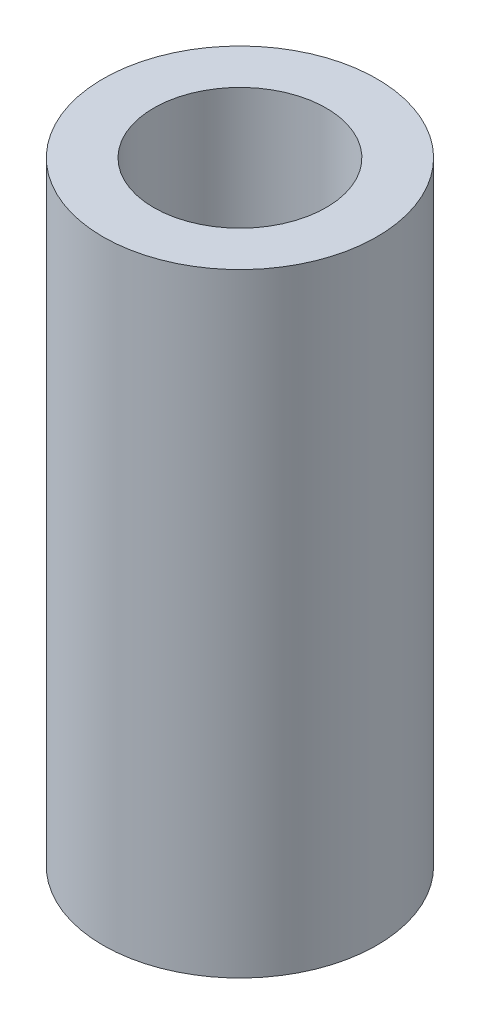
ISO-10303-21;
HEADER;
FILE_DESCRIPTION(('STEP AP214'),'2;1');
FILE_NAME('part.step','',(''),(''),'','','');
FILE_SCHEMA(('AUTOMOTIVE_DESIGN { 1 0 10303 214 1 1 1 1 }'));
ENDSEC;
DATA;
#1=APPLICATION_CONTEXT('core data for automotive mechanical design processes');
#2=APPLICATION_PROTOCOL_DEFINITION('international standard','automotive_design',2000,#1);
#3=PRODUCT_CONTEXT('',#1,'mechanical');
#4=PRODUCT('Part','Part','',(#3));
#5=PRODUCT_RELATED_PRODUCT_CATEGORY('part','',(#4));
#6=PRODUCT_DEFINITION_FORMATION('','',#4);
#7=PRODUCT_DEFINITION_CONTEXT('part definition',#1,'design');
#8=PRODUCT_DEFINITION('design','',#6,#7);
#9=PRODUCT_DEFINITION_SHAPE('','',#8);
#10=(LENGTH_UNIT() NAMED_UNIT(*) SI_UNIT(.MILLI.,.METRE.));
#11=(NAMED_UNIT(*) PLANE_ANGLE_UNIT() SI_UNIT($,.RADIAN.));
#12=(NAMED_UNIT(*) SI_UNIT($,.STERADIAN.) SOLID_ANGLE_UNIT());
#13=UNCERTAINTY_MEASURE_WITH_UNIT(LENGTH_MEASURE(1.E-05),#10,'distance_accuracy_value','');
#14=(GEOMETRIC_REPRESENTATION_CONTEXT(3) GLOBAL_UNCERTAINTY_ASSIGNED_CONTEXT((#13)) GLOBAL_UNIT_ASSIGNED_CONTEXT((#10,
#11,#12)) REPRESENTATION_CONTEXT('',''));
#15=CARTESIAN_POINT('',(0.,0.,0.));
#16=DIRECTION('',(0.,0.,1.));
#17=DIRECTION('',(1.,0.,0.));
#18=AXIS2_PLACEMENT_3D('',#15,#16,#17);
#19=CARTESIAN_POINT('',(0.,28.449999988,0.));
#20=DIRECTION('',(0.,-1.,0.));
#21=DIRECTION('',(0.,0.,-1.));
#22=AXIS2_PLACEMENT_3D('',#19,#20,#21);
#23=CYLINDRICAL_SURFACE('',#22,6.35);
#24=CARTESIAN_POINT('',(0.,28.449999988,0.));
#25=DIRECTION('',(0.,1.,0.));
#26=DIRECTION('',(0.,0.,1.));
#27=AXIS2_PLACEMENT_3D('',#24,#25,#26);
#28=CIRCLE('',#27,6.35);
#29=CARTESIAN_POINT('',(0.,28.449999988,6.35));
#30=VERTEX_POINT('',#29);
#31=EDGE_CURVE('E10',#30,#30,#28,.T.);
#32=ORIENTED_EDGE('',*,*,#31,.F.);
#33=EDGE_LOOP('',(#32));
#34=FACE_BOUND('',#33,.T.);
#35=CARTESIAN_POINT('',(0.,0.,0.));
#36=DIRECTION('',(0.,1.,0.));
#37=DIRECTION('',(0.,0.,1.));
#38=AXIS2_PLACEMENT_3D('',#35,#36,#37);
#39=CIRCLE('',#38,6.35);
#40=CARTESIAN_POINT('',(0.,0.,6.35));
#41=VERTEX_POINT('',#40);
#42=EDGE_CURVE('E46',#41,#41,#39,.T.);
#43=ORIENTED_EDGE('',*,*,#42,.T.);
#44=EDGE_LOOP('',(#43));
#45=FACE_BOUND('',#44,.T.);
#46=ADVANCED_FACE('F43',(#34,#45),#23,.T.);
#47=CARTESIAN_POINT('',(0.,28.449999988,0.));
#48=DIRECTION('',(0.,1.,0.));
#49=DIRECTION('',(0.,0.,1.));
#50=AXIS2_PLACEMENT_3D('',#47,#48,#49);
#51=PLANE('',#50);
#52=CARTESIAN_POINT('',(0.,28.449999988,0.));
#53=DIRECTION('',(0.,1.,0.));
#54=DIRECTION('',(0.,0.,1.));
#55=AXIS2_PLACEMENT_3D('',#52,#53,#54);
#56=CIRCLE('',#55,4.);
#57=CARTESIAN_POINT('',(0.,28.449999988,4.));
#58=VERTEX_POINT('',#57);
#59=EDGE_CURVE('E57',#58,#58,#56,.T.);
#60=ORIENTED_EDGE('',*,*,#59,.F.);
#61=EDGE_LOOP('',(#60));
#62=FACE_BOUND('',#61,.T.);
#63=ORIENTED_EDGE('',*,*,#31,.T.);
#64=EDGE_LOOP('',(#63));
#65=FACE_BOUND('',#64,.T.);
#66=ADVANCED_FACE('F74',(#62,#65),#51,.T.);
#67=CARTESIAN_POINT('',(0.,0.,0.));
#68=DIRECTION('',(0.,1.,0.));
#69=DIRECTION('',(0.,0.,1.));
#70=AXIS2_PLACEMENT_3D('',#67,#68,#69);
#71=PLANE('',#70);
#72=CARTESIAN_POINT('',(0.,0.,0.));
#73=DIRECTION('',(0.,1.,0.));
#74=DIRECTION('',(0.,0.,1.));
#75=AXIS2_PLACEMENT_3D('',#72,#73,#74);
#76=CIRCLE('',#75,4.);
#77=CARTESIAN_POINT('',(0.,0.,4.));
#78=VERTEX_POINT('',#77);
#79=EDGE_CURVE('E55',#78,#78,#76,.T.);
#80=ORIENTED_EDGE('',*,*,#79,.T.);
#81=EDGE_LOOP('',(#80));
#82=FACE_BOUND('',#81,.T.);
#83=ORIENTED_EDGE('',*,*,#42,.F.);
#84=EDGE_LOOP('',(#83));
#85=FACE_BOUND('',#84,.T.);
#86=ADVANCED_FACE('F65',(#82,#85),#71,.F.);
#87=CARTESIAN_POINT('',(0.,0.,0.));
#88=DIRECTION('',(0.,1.,0.));
#89=DIRECTION('',(0.,0.,1.));
#90=AXIS2_PLACEMENT_3D('',#87,#88,#89);
#91=CYLINDRICAL_SURFACE('',#90,4.);
#92=ORIENTED_EDGE('',*,*,#79,.F.);
#93=EDGE_LOOP('',(#92));
#94=FACE_BOUND('',#93,.T.);
#95=ORIENTED_EDGE('',*,*,#59,.T.);
#96=EDGE_LOOP('',(#95));
#97=FACE_BOUND('',#96,.T.);
#98=ADVANCED_FACE('F68',(#94,#97),#91,.F.);
#99=CLOSED_SHELL('',(#46,#66,#86,#98));
#100=MANIFOLD_SOLID_BREP('B2',#99);
#101=ADVANCED_BREP_SHAPE_REPRESENTATION('',(#18,#100),#14);
#102=SHAPE_DEFINITION_REPRESENTATION(#9,#101);
ENDSEC;
END-ISO-10303-21;
